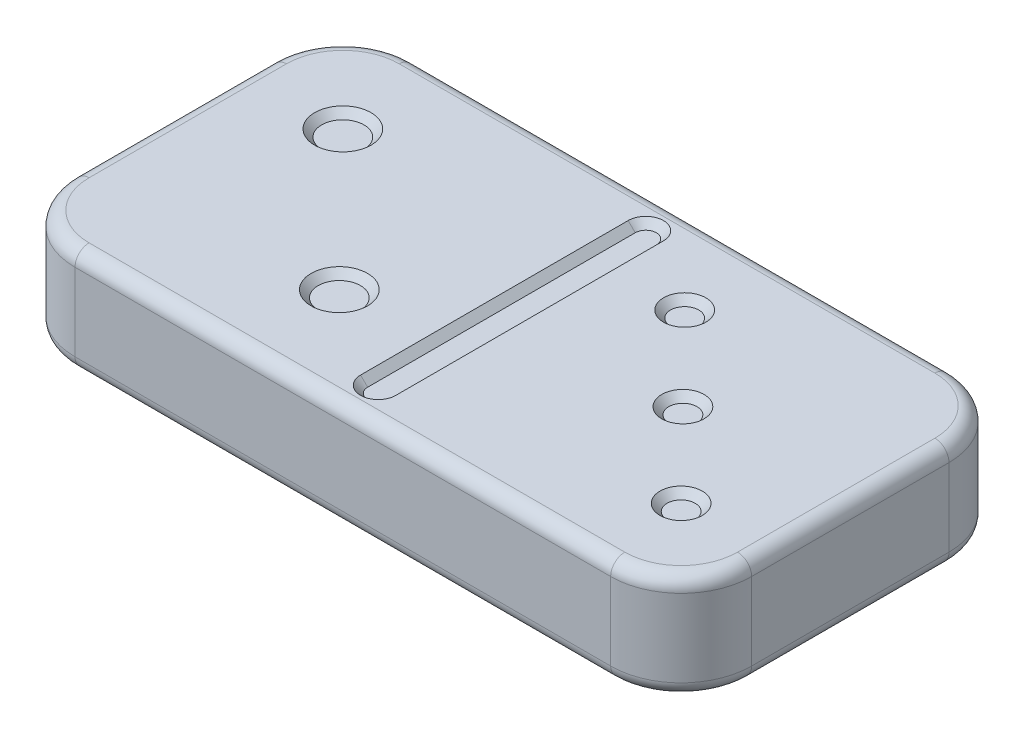
ISO-10303-21;
HEADER;
FILE_DESCRIPTION(('STEP AP214'),'2;1');
FILE_NAME('part.step','',(''),(''),'','','');
FILE_SCHEMA(('AUTOMOTIVE_DESIGN { 1 0 10303 214 1 1 1 1 }'));
ENDSEC;
DATA;
#1=APPLICATION_CONTEXT('core data for automotive mechanical design processes');
#2=APPLICATION_PROTOCOL_DEFINITION('international standard','automotive_design',2000,#1);
#3=PRODUCT_CONTEXT('',#1,'mechanical');
#4=PRODUCT('Part','Part','',(#3));
#5=PRODUCT_RELATED_PRODUCT_CATEGORY('part','',(#4));
#6=PRODUCT_DEFINITION_FORMATION('','',#4);
#7=PRODUCT_DEFINITION_CONTEXT('part definition',#1,'design');
#8=PRODUCT_DEFINITION('design','',#6,#7);
#9=PRODUCT_DEFINITION_SHAPE('','',#8);
#10=(LENGTH_UNIT() NAMED_UNIT(*) SI_UNIT(.MILLI.,.METRE.));
#11=(NAMED_UNIT(*) PLANE_ANGLE_UNIT() SI_UNIT($,.RADIAN.));
#12=(NAMED_UNIT(*) SI_UNIT($,.STERADIAN.) SOLID_ANGLE_UNIT());
#13=UNCERTAINTY_MEASURE_WITH_UNIT(LENGTH_MEASURE(1.E-05),#10,'distance_accuracy_value','');
#14=(GEOMETRIC_REPRESENTATION_CONTEXT(3) GLOBAL_UNCERTAINTY_ASSIGNED_CONTEXT((#13)) GLOBAL_UNIT_ASSIGNED_CONTEXT((#10,
#11,#12)) REPRESENTATION_CONTEXT('',''));
#15=CARTESIAN_POINT('',(0.,0.,0.));
#16=DIRECTION('',(0.,0.,1.));
#17=DIRECTION('',(1.,0.,0.));
#18=AXIS2_PLACEMENT_3D('',#15,#16,#17);
#19=CARTESIAN_POINT('',(0.,7.5,0.));
#20=DIRECTION('',(1.,0.,0.));
#21=DIRECTION('',(0.,0.,-1.));
#22=AXIS2_PLACEMENT_3D('',#19,#20,#21);
#23=PLANE('',#22);
#24=DIRECTION('',(0.,-1.,0.));
#25=VECTOR('',#24,1.);
#26=CARTESIAN_POINT('',(0.,7.5,-19.));
#27=LINE('',#26,#25);
#28=CARTESIAN_POINT('',(0.,6.5,-19.));
#29=VERTEX_POINT('',#28);
#30=CARTESIAN_POINT('',(0.,1.,-19.));
#31=VERTEX_POINT('',#30);
#32=EDGE_CURVE('E834',#29,#31,#27,.T.);
#33=ORIENTED_EDGE('',*,*,#32,.T.);
#34=DIRECTION('',(0.,0.,1.));
#35=VECTOR('',#34,1.);
#36=CARTESIAN_POINT('',(0.,1.,-5.));
#37=LINE('',#36,#35);
#38=CARTESIAN_POINT('',(0.,1.,-5.));
#39=VERTEX_POINT('',#38);
#40=EDGE_CURVE('E300',#31,#39,#37,.T.);
#41=ORIENTED_EDGE('',*,*,#40,.T.);
#42=DIRECTION('',(0.,-1.,0.));
#43=VECTOR('',#42,1.);
#44=CARTESIAN_POINT('',(0.,7.5,-5.));
#45=LINE('',#44,#43);
#46=CARTESIAN_POINT('',(0.,6.5,-5.));
#47=VERTEX_POINT('',#46);
#48=EDGE_CURVE('E195',#39,#47,#45,.F.);
#49=ORIENTED_EDGE('',*,*,#48,.T.);
#50=DIRECTION('',(0.,0.,1.));
#51=VECTOR('',#50,1.);
#52=CARTESIAN_POINT('',(0.,6.5,0.));
#53=LINE('',#52,#51);
#54=EDGE_CURVE('E224',#47,#29,#53,.F.);
#55=ORIENTED_EDGE('',*,*,#54,.T.);
#56=EDGE_LOOP('',(#33,#41,#49,#55));
#57=FACE_BOUND('',#56,.T.);
#58=ADVANCED_FACE('F37',(#57),#23,.F.);
#59=CARTESIAN_POINT('',(0.,7.5,0.));
#60=DIRECTION('',(0.,0.,-1.));
#61=DIRECTION('',(-1.,0.,0.));
#62=AXIS2_PLACEMENT_3D('',#59,#60,#61);
#63=PLANE('',#62);
#64=DIRECTION('',(0.,-1.,0.));
#65=VECTOR('',#64,1.);
#66=CARTESIAN_POINT('',(5.,7.5,0.));
#67=LINE('',#66,#65);
#68=CARTESIAN_POINT('',(5.,6.5,0.));
#69=VERTEX_POINT('',#68);
#70=CARTESIAN_POINT('',(5.,1.,0.));
#71=VERTEX_POINT('',#70);
#72=EDGE_CURVE('E820',#69,#71,#67,.T.);
#73=ORIENTED_EDGE('',*,*,#72,.T.);
#74=DIRECTION('',(1.,0.,0.));
#75=VECTOR('',#74,1.);
#76=CARTESIAN_POINT('',(43.,1.,0.));
#77=LINE('',#76,#75);
#78=CARTESIAN_POINT('',(43.,1.,0.));
#79=VERTEX_POINT('',#78);
#80=EDGE_CURVE('E294',#71,#79,#77,.T.);
#81=ORIENTED_EDGE('',*,*,#80,.T.);
#82=DIRECTION('',(0.,-1.,0.));
#83=VECTOR('',#82,1.);
#84=CARTESIAN_POINT('',(43.,7.5,0.));
#85=LINE('',#84,#83);
#86=CARTESIAN_POINT('',(43.,6.5,0.));
#87=VERTEX_POINT('',#86);
#88=EDGE_CURVE('E824',#79,#87,#85,.F.);
#89=ORIENTED_EDGE('',*,*,#88,.T.);
#90=DIRECTION('',(1.,0.,0.));
#91=VECTOR('',#90,1.);
#92=CARTESIAN_POINT('',(0.,6.5,0.));
#93=LINE('',#92,#91);
#94=EDGE_CURVE('E217',#87,#69,#93,.F.);
#95=ORIENTED_EDGE('',*,*,#94,.T.);
#96=EDGE_LOOP('',(#73,#81,#89,#95));
#97=FACE_BOUND('',#96,.T.);
#98=ADVANCED_FACE('F403',(#97),#63,.F.);
#99=CARTESIAN_POINT('',(48.,7.5,0.));
#100=DIRECTION('',(-1.,0.,0.));
#101=DIRECTION('',(0.,0.,1.));
#102=AXIS2_PLACEMENT_3D('',#99,#100,#101);
#103=PLANE('',#102);
#104=DIRECTION('',(0.,-1.,0.));
#105=VECTOR('',#104,1.);
#106=CARTESIAN_POINT('',(48.,7.5,-5.));
#107=LINE('',#106,#105);
#108=CARTESIAN_POINT('',(48.,6.5,-5.));
#109=VERTEX_POINT('',#108);
#110=CARTESIAN_POINT('',(48.,1.,-5.));
#111=VERTEX_POINT('',#110);
#112=EDGE_CURVE('E817',#109,#111,#107,.T.);
#113=ORIENTED_EDGE('',*,*,#112,.T.);
#114=DIRECTION('',(0.,0.,-1.));
#115=VECTOR('',#114,1.);
#116=CARTESIAN_POINT('',(48.,1.,-19.));
#117=LINE('',#116,#115);
#118=CARTESIAN_POINT('',(48.,1.,-19.));
#119=VERTEX_POINT('',#118);
#120=EDGE_CURVE('E288',#111,#119,#117,.T.);
#121=ORIENTED_EDGE('',*,*,#120,.T.);
#122=DIRECTION('',(0.,-1.,0.));
#123=VECTOR('',#122,1.);
#124=CARTESIAN_POINT('',(48.,7.5,-19.));
#125=LINE('',#124,#123);
#126=CARTESIAN_POINT('',(48.,6.5,-19.));
#127=VERTEX_POINT('',#126);
#128=EDGE_CURVE('E259',#119,#127,#125,.F.);
#129=ORIENTED_EDGE('',*,*,#128,.T.);
#130=DIRECTION('',(0.,0.,-1.));
#131=VECTOR('',#130,1.);
#132=CARTESIAN_POINT('',(48.,6.5,0.));
#133=LINE('',#132,#131);
#134=EDGE_CURVE('E205',#127,#109,#133,.F.);
#135=ORIENTED_EDGE('',*,*,#134,.T.);
#136=EDGE_LOOP('',(#113,#121,#129,#135));
#137=FACE_BOUND('',#136,.T.);
#138=ADVANCED_FACE('F409',(#137),#103,.F.);
#139=CARTESIAN_POINT('',(0.,7.5,-24.));
#140=DIRECTION('',(0.,0.,1.));
#141=DIRECTION('',(1.,0.,0.));
#142=AXIS2_PLACEMENT_3D('',#139,#140,#141);
#143=PLANE('',#142);
#144=DIRECTION('',(0.,-1.,0.));
#145=VECTOR('',#144,1.);
#146=CARTESIAN_POINT('',(43.,7.5,-24.));
#147=LINE('',#146,#145);
#148=CARTESIAN_POINT('',(43.,6.5,-24.));
#149=VERTEX_POINT('',#148);
#150=CARTESIAN_POINT('',(43.,1.,-24.));
#151=VERTEX_POINT('',#150);
#152=EDGE_CURVE('E830',#149,#151,#147,.T.);
#153=ORIENTED_EDGE('',*,*,#152,.T.);
#154=DIRECTION('',(-1.,0.,0.));
#155=VECTOR('',#154,1.);
#156=CARTESIAN_POINT('',(4.99999999999999,1.,-24.));
#157=LINE('',#156,#155);
#158=CARTESIAN_POINT('',(4.99999999999999,1.,-24.));
#159=VERTEX_POINT('',#158);
#160=EDGE_CURVE('E306',#151,#159,#157,.T.);
#161=ORIENTED_EDGE('',*,*,#160,.T.);
#162=DIRECTION('',(0.,-1.,0.));
#163=VECTOR('',#162,1.);
#164=CARTESIAN_POINT('',(4.99999999999999,7.5,-24.));
#165=LINE('',#164,#163);
#166=CARTESIAN_POINT('',(4.99999999999999,6.5,-24.));
#167=VERTEX_POINT('',#166);
#168=EDGE_CURVE('E827',#159,#167,#165,.F.);
#169=ORIENTED_EDGE('',*,*,#168,.T.);
#170=DIRECTION('',(-1.,0.,0.));
#171=VECTOR('',#170,1.);
#172=CARTESIAN_POINT('',(0.,6.5,-24.));
#173=LINE('',#172,#171);
#174=EDGE_CURVE('E231',#167,#149,#173,.F.);
#175=ORIENTED_EDGE('',*,*,#174,.T.);
#176=EDGE_LOOP('',(#153,#161,#169,#175));
#177=FACE_BOUND('',#176,.T.);
#178=ADVANCED_FACE('F708',(#177),#143,.F.);
#179=CARTESIAN_POINT('',(0.,7.5,-24.));
#180=DIRECTION('',(0.,-1.,0.));
#181=DIRECTION('',(0.,0.,-1.));
#182=AXIS2_PLACEMENT_3D('',#179,#180,#181);
#183=PLANE('',#182);
#184=CARTESIAN_POINT('',(16.75,7.5,-7.));
#185=DIRECTION('',(0.,1.,0.));
#186=DIRECTION('',(0.,0.,1.));
#187=AXIS2_PLACEMENT_3D('',#184,#185,#186);
#188=CIRCLE('',#187,2.);
#189=CARTESIAN_POINT('',(16.75,7.5,-5.));
#190=VERTEX_POINT('',#189);
#191=EDGE_CURVE('E787',#190,#190,#188,.T.);
#192=ORIENTED_EDGE('',*,*,#191,.F.);
#193=EDGE_LOOP('',(#192));
#194=FACE_BOUND('',#193,.T.);
#195=CARTESIAN_POINT('',(6.99999999999999,7.5,-17.));
#196=DIRECTION('',(0.,1.,0.));
#197=DIRECTION('',(0.,0.,1.));
#198=AXIS2_PLACEMENT_3D('',#195,#196,#197);
#199=CIRCLE('',#198,2.);
#200=CARTESIAN_POINT('',(6.99999999999999,7.5,-15.));
#201=VERTEX_POINT('',#200);
#202=EDGE_CURVE('E791',#201,#201,#199,.T.);
#203=ORIENTED_EDGE('',*,*,#202,.F.);
#204=EDGE_LOOP('',(#203));
#205=FACE_BOUND('',#204,.T.);
#206=CARTESIAN_POINT('',(42.,7.5,-6.));
#207=DIRECTION('',(0.,1.,0.));
#208=DIRECTION('',(0.,0.,1.));
#209=AXIS2_PLACEMENT_3D('',#206,#207,#208);
#210=CIRCLE('',#209,1.5);
#211=CARTESIAN_POINT('',(42.,7.5,-4.5));
#212=VERTEX_POINT('',#211);
#213=EDGE_CURVE('E795',#212,#212,#210,.T.);
#214=ORIENTED_EDGE('',*,*,#213,.F.);
#215=EDGE_LOOP('',(#214));
#216=FACE_BOUND('',#215,.T.);
#217=CARTESIAN_POINT('',(36.125,7.5,-12.));
#218=DIRECTION('',(0.,1.,0.));
#219=DIRECTION('',(0.,0.,1.));
#220=AXIS2_PLACEMENT_3D('',#217,#218,#219);
#221=CIRCLE('',#220,1.5);
#222=CARTESIAN_POINT('',(36.125,7.5,-10.5));
#223=VERTEX_POINT('',#222);
#224=EDGE_CURVE('E799',#223,#223,#221,.T.);
#225=ORIENTED_EDGE('',*,*,#224,.F.);
#226=EDGE_LOOP('',(#225));
#227=FACE_BOUND('',#226,.T.);
#228=CARTESIAN_POINT('',(30.25,7.5,-18.));
#229=DIRECTION('',(0.,1.,0.));
#230=DIRECTION('',(0.,0.,1.));
#231=AXIS2_PLACEMENT_3D('',#228,#229,#230);
#232=CIRCLE('',#231,1.5);
#233=CARTESIAN_POINT('',(30.25,7.5,-16.5));
#234=VERTEX_POINT('',#233);
#235=EDGE_CURVE('E802',#234,#234,#232,.T.);
#236=ORIENTED_EDGE('',*,*,#235,.F.);
#237=EDGE_LOOP('',(#236));
#238=FACE_BOUND('',#237,.T.);
#239=DIRECTION('',(0.,0.,-1.));
#240=VECTOR('',#239,1.);
#241=CARTESIAN_POINT('',(22.75,7.5,-24.));
#242=LINE('',#241,#240);
#243=CARTESIAN_POINT('',(22.75,7.5,-2.5085750787772));
#244=VERTEX_POINT('',#243);
#245=CARTESIAN_POINT('',(22.75,7.5,-21.4914249212228));
#246=VERTEX_POINT('',#245);
#247=EDGE_CURVE('E309',#244,#246,#242,.T.);
#248=ORIENTED_EDGE('',*,*,#247,.T.);
#249=CARTESIAN_POINT('',(24.,7.5,-21.4914249212228));
#250=DIRECTION('',(0.,-1.,0.));
#251=DIRECTION('',(0.,0.,-1.));
#252=AXIS2_PLACEMENT_3D('',#249,#250,#251);
#253=CIRCLE('',#252,1.25000000000001);
#254=CARTESIAN_POINT('',(25.25,7.5,-21.4914249212228));
#255=VERTEX_POINT('',#254);
#256=EDGE_CURVE('E347',#246,#255,#253,.T.);
#257=ORIENTED_EDGE('',*,*,#256,.T.);
#258=DIRECTION('',(0.,0.,1.));
#259=VECTOR('',#258,1.);
#260=CARTESIAN_POINT('',(25.25,7.5,-24.));
#261=LINE('',#260,#259);
#262=CARTESIAN_POINT('',(25.25,7.5,-2.5085750787772));
#263=VERTEX_POINT('',#262);
#264=EDGE_CURVE('E344',#255,#263,#261,.T.);
#265=ORIENTED_EDGE('',*,*,#264,.T.);
#266=CARTESIAN_POINT('',(24.,7.5,-2.5085750787772));
#267=DIRECTION('',(0.,-1.,0.));
#268=DIRECTION('',(0.,0.,-1.));
#269=AXIS2_PLACEMENT_3D('',#266,#267,#268);
#270=CIRCLE('',#269,1.25000000000001);
#271=EDGE_CURVE('E341',#263,#244,#270,.T.);
#272=ORIENTED_EDGE('',*,*,#271,.T.);
#273=EDGE_LOOP('',(#248,#257,#265,#272));
#274=FACE_BOUND('',#273,.T.);
#275=DIRECTION('',(0.,0.,-1.));
#276=VECTOR('',#275,1.);
#277=CARTESIAN_POINT('',(47.,7.5,-24.));
#278=LINE('',#277,#276);
#279=CARTESIAN_POINT('',(47.,7.5,-5.));
#280=VERTEX_POINT('',#279);
#281=CARTESIAN_POINT('',(47.,7.5,-19.));
#282=VERTEX_POINT('',#281);
#283=EDGE_CURVE('E199',#280,#282,#278,.T.);
#284=ORIENTED_EDGE('',*,*,#283,.T.);
#285=CARTESIAN_POINT('',(43.,7.5,-19.));
#286=DIRECTION('',(0.,-1.,0.));
#287=DIRECTION('',(0.,0.,-1.));
#288=AXIS2_PLACEMENT_3D('',#285,#286,#287);
#289=CIRCLE('',#288,4.);
#290=CARTESIAN_POINT('',(43.,7.5,-23.));
#291=VERTEX_POINT('',#290);
#292=EDGE_CURVE('E177',#282,#291,#289,.F.);
#293=ORIENTED_EDGE('',*,*,#292,.T.);
#294=DIRECTION('',(-1.,0.,0.));
#295=VECTOR('',#294,1.);
#296=CARTESIAN_POINT('',(0.,7.5,-23.));
#297=LINE('',#296,#295);
#298=CARTESIAN_POINT('',(4.99999999999999,7.5,-23.));
#299=VERTEX_POINT('',#298);
#300=EDGE_CURVE('E187',#291,#299,#297,.T.);
#301=ORIENTED_EDGE('',*,*,#300,.T.);
#302=CARTESIAN_POINT('',(4.99999999999999,7.5,-19.));
#303=DIRECTION('',(0.,-1.,0.));
#304=DIRECTION('',(0.,0.,-1.));
#305=AXIS2_PLACEMENT_3D('',#302,#303,#304);
#306=CIRCLE('',#305,4.);
#307=CARTESIAN_POINT('',(0.999999999999989,7.5,-19.));
#308=VERTEX_POINT('',#307);
#309=EDGE_CURVE('E194',#299,#308,#306,.F.);
#310=ORIENTED_EDGE('',*,*,#309,.T.);
#311=DIRECTION('',(0.,0.,1.));
#312=VECTOR('',#311,1.);
#313=CARTESIAN_POINT('',(0.999999999999986,7.5,-24.));
#314=LINE('',#313,#312);
#315=CARTESIAN_POINT('',(0.999999999999997,7.5,-5.));
#316=VERTEX_POINT('',#315);
#317=EDGE_CURVE('E841',#308,#316,#314,.T.);
#318=ORIENTED_EDGE('',*,*,#317,.T.);
#319=CARTESIAN_POINT('',(5.,7.5,-5.));
#320=DIRECTION('',(0.,-1.,0.));
#321=DIRECTION('',(0.,0.,-1.));
#322=AXIS2_PLACEMENT_3D('',#319,#320,#321);
#323=CIRCLE('',#322,4.);
#324=CARTESIAN_POINT('',(5.,7.5,-1.));
#325=VERTEX_POINT('',#324);
#326=EDGE_CURVE('E844',#316,#325,#323,.F.);
#327=ORIENTED_EDGE('',*,*,#326,.T.);
#328=DIRECTION('',(1.,0.,0.));
#329=VECTOR('',#328,1.);
#330=CARTESIAN_POINT('',(0.,7.5,-1.));
#331=LINE('',#330,#329);
#332=CARTESIAN_POINT('',(43.,7.5,-1.));
#333=VERTEX_POINT('',#332);
#334=EDGE_CURVE('E847',#325,#333,#331,.T.);
#335=ORIENTED_EDGE('',*,*,#334,.T.);
#336=CARTESIAN_POINT('',(43.,7.5,-5.));
#337=DIRECTION('',(0.,-1.,0.));
#338=DIRECTION('',(0.,0.,-1.));
#339=AXIS2_PLACEMENT_3D('',#336,#337,#338);
#340=CIRCLE('',#339,4.);
#341=EDGE_CURVE('E207',#333,#280,#340,.F.);
#342=ORIENTED_EDGE('',*,*,#341,.T.);
#343=EDGE_LOOP('',(#284,#293,#301,#310,#318,#327,#335,#342));
#344=FACE_BOUND('',#343,.T.);
#345=ADVANCED_FACE('F197',(#194,#205,#216,#227,#238,#274,#344),#183,.F.);
#346=CARTESIAN_POINT('',(0.,0.,-24.));
#347=DIRECTION('',(0.,-1.,0.));
#348=DIRECTION('',(0.,0.,-1.));
#349=AXIS2_PLACEMENT_3D('',#346,#347,#348);
#350=PLANE('',#349);
#351=DIRECTION('',(-1.,0.,0.));
#352=VECTOR('',#351,1.);
#353=CARTESIAN_POINT('',(43.,0.,-23.));
#354=LINE('',#353,#352);
#355=CARTESIAN_POINT('',(4.99999999999999,0.,-23.));
#356=VERTEX_POINT('',#355);
#357=CARTESIAN_POINT('',(43.,0.,-23.));
#358=VERTEX_POINT('',#357);
#359=EDGE_CURVE('E233',#356,#358,#354,.F.);
#360=ORIENTED_EDGE('',*,*,#359,.T.);
#361=CARTESIAN_POINT('',(43.,0.,-19.));
#362=DIRECTION('',(0.,-1.,0.));
#363=DIRECTION('',(0.,0.,-1.));
#364=AXIS2_PLACEMENT_3D('',#361,#362,#363);
#365=CIRCLE('',#364,4.);
#366=CARTESIAN_POINT('',(47.,0.,-19.));
#367=VERTEX_POINT('',#366);
#368=EDGE_CURVE('E280',#358,#367,#365,.T.);
#369=ORIENTED_EDGE('',*,*,#368,.T.);
#370=DIRECTION('',(0.,0.,-1.));
#371=VECTOR('',#370,1.);
#372=CARTESIAN_POINT('',(47.,0.,-5.));
#373=LINE('',#372,#371);
#374=CARTESIAN_POINT('',(47.,0.,-5.));
#375=VERTEX_POINT('',#374);
#376=EDGE_CURVE('E277',#367,#375,#373,.F.);
#377=ORIENTED_EDGE('',*,*,#376,.T.);
#378=CARTESIAN_POINT('',(43.,0.,-5.));
#379=DIRECTION('',(0.,-1.,0.));
#380=DIRECTION('',(0.,0.,-1.));
#381=AXIS2_PLACEMENT_3D('',#378,#379,#380);
#382=CIRCLE('',#381,4.);
#383=CARTESIAN_POINT('',(43.,0.,-1.));
#384=VERTEX_POINT('',#383);
#385=EDGE_CURVE('E274',#375,#384,#382,.T.);
#386=ORIENTED_EDGE('',*,*,#385,.T.);
#387=DIRECTION('',(1.,0.,0.));
#388=VECTOR('',#387,1.);
#389=CARTESIAN_POINT('',(5.,0.,-1.));
#390=LINE('',#389,#388);
#391=CARTESIAN_POINT('',(5.,0.,-1.));
#392=VERTEX_POINT('',#391);
#393=EDGE_CURVE('E271',#384,#392,#390,.F.);
#394=ORIENTED_EDGE('',*,*,#393,.T.);
#395=CARTESIAN_POINT('',(5.,0.,-5.));
#396=DIRECTION('',(0.,-1.,0.));
#397=DIRECTION('',(0.,0.,-1.));
#398=AXIS2_PLACEMENT_3D('',#395,#396,#397);
#399=CIRCLE('',#398,4.);
#400=CARTESIAN_POINT('',(0.999999999999997,0.,-5.));
#401=VERTEX_POINT('',#400);
#402=EDGE_CURVE('E268',#392,#401,#399,.T.);
#403=ORIENTED_EDGE('',*,*,#402,.T.);
#404=DIRECTION('',(0.,0.,1.));
#405=VECTOR('',#404,1.);
#406=CARTESIAN_POINT('',(0.999999999999989,0.,-19.));
#407=LINE('',#406,#405);
#408=CARTESIAN_POINT('',(0.999999999999989,0.,-19.));
#409=VERTEX_POINT('',#408);
#410=EDGE_CURVE('E265',#401,#409,#407,.F.);
#411=ORIENTED_EDGE('',*,*,#410,.T.);
#412=CARTESIAN_POINT('',(4.99999999999999,0.,-19.));
#413=DIRECTION('',(0.,-1.,0.));
#414=DIRECTION('',(0.,0.,-1.));
#415=AXIS2_PLACEMENT_3D('',#412,#413,#414);
#416=CIRCLE('',#415,4.);
#417=EDGE_CURVE('E262',#409,#356,#416,.T.);
#418=ORIENTED_EDGE('',*,*,#417,.T.);
#419=EDGE_LOOP('',(#360,#369,#377,#386,#394,#403,#411,#418));
#420=FACE_BOUND('',#419,.T.);
#421=ADVANCED_FACE('F419',(#420),#350,.T.);
#422=CARTESIAN_POINT('',(43.,7.5,-5.));
#423=DIRECTION('',(0.,-1.,0.));
#424=DIRECTION('',(0.,0.,-1.));
#425=AXIS2_PLACEMENT_3D('',#422,#423,#424);
#426=CYLINDRICAL_SURFACE('',#425,5.);
#427=ORIENTED_EDGE('',*,*,#88,.F.);
#428=CARTESIAN_POINT('',(43.,1.,-5.));
#429=DIRECTION('',(0.,-1.,0.));
#430=DIRECTION('',(0.,0.,-1.));
#431=AXIS2_PLACEMENT_3D('',#428,#429,#430);
#432=CIRCLE('',#431,5.);
#433=EDGE_CURVE('E291',#79,#111,#432,.F.);
#434=ORIENTED_EDGE('',*,*,#433,.T.);
#435=ORIENTED_EDGE('',*,*,#112,.F.);
#436=CARTESIAN_POINT('',(43.,6.5,-5.));
#437=DIRECTION('',(0.,-1.,0.));
#438=DIRECTION('',(0.,0.,-1.));
#439=AXIS2_PLACEMENT_3D('',#436,#437,#438);
#440=CIRCLE('',#439,5.);
#441=EDGE_CURVE('E213',#109,#87,#440,.T.);
#442=ORIENTED_EDGE('',*,*,#441,.T.);
#443=EDGE_LOOP('',(#427,#434,#435,#442));
#444=FACE_BOUND('',#443,.T.);
#445=ADVANCED_FACE('F415',(#444),#426,.T.);
#446=CARTESIAN_POINT('',(43.,7.5,-19.));
#447=DIRECTION('',(0.,-1.,0.));
#448=DIRECTION('',(0.,0.,-1.));
#449=AXIS2_PLACEMENT_3D('',#446,#447,#448);
#450=CYLINDRICAL_SURFACE('',#449,5.);
#451=ORIENTED_EDGE('',*,*,#128,.F.);
#452=CARTESIAN_POINT('',(43.,1.,-19.));
#453=DIRECTION('',(0.,-1.,0.));
#454=DIRECTION('',(0.,0.,-1.));
#455=AXIS2_PLACEMENT_3D('',#452,#453,#454);
#456=CIRCLE('',#455,5.);
#457=EDGE_CURVE('E284',#119,#151,#456,.F.);
#458=ORIENTED_EDGE('',*,*,#457,.T.);
#459=ORIENTED_EDGE('',*,*,#152,.F.);
#460=CARTESIAN_POINT('',(43.,6.5,-19.));
#461=DIRECTION('',(0.,-1.,0.));
#462=DIRECTION('',(0.,0.,-1.));
#463=AXIS2_PLACEMENT_3D('',#460,#461,#462);
#464=CIRCLE('',#463,5.);
#465=EDGE_CURVE('E179',#149,#127,#464,.T.);
#466=ORIENTED_EDGE('',*,*,#465,.T.);
#467=EDGE_LOOP('',(#451,#458,#459,#466));
#468=FACE_BOUND('',#467,.T.);
#469=ADVANCED_FACE('F418',(#468),#450,.T.);
#470=CARTESIAN_POINT('',(5.,7.5,-5.));
#471=DIRECTION('',(0.,-1.,0.));
#472=DIRECTION('',(0.,0.,-1.));
#473=AXIS2_PLACEMENT_3D('',#470,#471,#472);
#474=CYLINDRICAL_SURFACE('',#473,5.);
#475=ORIENTED_EDGE('',*,*,#48,.F.);
#476=CARTESIAN_POINT('',(5.,1.,-5.));
#477=DIRECTION('',(0.,-1.,0.));
#478=DIRECTION('',(0.,0.,-1.));
#479=AXIS2_PLACEMENT_3D('',#476,#477,#478);
#480=CIRCLE('',#479,5.);
#481=EDGE_CURVE('E297',#39,#71,#480,.F.);
#482=ORIENTED_EDGE('',*,*,#481,.T.);
#483=ORIENTED_EDGE('',*,*,#72,.F.);
#484=CARTESIAN_POINT('',(5.,6.5,-5.));
#485=DIRECTION('',(0.,-1.,0.));
#486=DIRECTION('',(0.,0.,-1.));
#487=AXIS2_PLACEMENT_3D('',#484,#485,#486);
#488=CIRCLE('',#487,5.);
#489=EDGE_CURVE('E220',#69,#47,#488,.T.);
#490=ORIENTED_EDGE('',*,*,#489,.T.);
#491=EDGE_LOOP('',(#475,#482,#483,#490));
#492=FACE_BOUND('',#491,.T.);
#493=ADVANCED_FACE('F423',(#492),#474,.T.);
#494=CARTESIAN_POINT('',(4.99999999999999,7.5,-19.));
#495=DIRECTION('',(0.,-1.,0.));
#496=DIRECTION('',(0.,0.,-1.));
#497=AXIS2_PLACEMENT_3D('',#494,#495,#496);
#498=CYLINDRICAL_SURFACE('',#497,5.);
#499=ORIENTED_EDGE('',*,*,#168,.F.);
#500=CARTESIAN_POINT('',(4.99999999999999,1.,-19.));
#501=DIRECTION('',(0.,-1.,0.));
#502=DIRECTION('',(0.,0.,-1.));
#503=AXIS2_PLACEMENT_3D('',#500,#501,#502);
#504=CIRCLE('',#503,5.);
#505=EDGE_CURVE('E303',#159,#31,#504,.F.);
#506=ORIENTED_EDGE('',*,*,#505,.T.);
#507=ORIENTED_EDGE('',*,*,#32,.F.);
#508=CARTESIAN_POINT('',(4.99999999999999,6.5,-19.));
#509=DIRECTION('',(0.,-1.,0.));
#510=DIRECTION('',(0.,0.,-1.));
#511=AXIS2_PLACEMENT_3D('',#508,#509,#510);
#512=CIRCLE('',#511,5.);
#513=EDGE_CURVE('E227',#29,#167,#512,.T.);
#514=ORIENTED_EDGE('',*,*,#513,.T.);
#515=EDGE_LOOP('',(#499,#506,#507,#514));
#516=FACE_BOUND('',#515,.T.);
#517=ADVANCED_FACE('F427',(#516),#498,.T.);
#518=CARTESIAN_POINT('',(5.,6.5,-5.));
#519=DIRECTION('',(0.,-1.,0.));
#520=DIRECTION('',(0.,0.,-1.));
#521=AXIS2_PLACEMENT_3D('',#518,#519,#520);
#522=TOROIDAL_SURFACE('',#521,4.,1.);
#523=CARTESIAN_POINT('',(0.999999999999997,6.5,-5.));
#524=DIRECTION('',(0.,0.,-1.));
#525=DIRECTION('',(-1.,0.,0.));
#526=AXIS2_PLACEMENT_3D('',#523,#524,#525);
#527=CIRCLE('',#526,1.);
#528=EDGE_CURVE('E251',#47,#316,#527,.T.);
#529=ORIENTED_EDGE('',*,*,#528,.F.);
#530=ORIENTED_EDGE('',*,*,#489,.F.);
#531=CARTESIAN_POINT('',(5.,6.5,-1.));
#532=DIRECTION('',(1.,0.,0.));
#533=DIRECTION('',(0.,0.,-1.));
#534=AXIS2_PLACEMENT_3D('',#531,#532,#533);
#535=CIRCLE('',#534,1.);
#536=EDGE_CURVE('E255',#325,#69,#535,.T.);
#537=ORIENTED_EDGE('',*,*,#536,.F.);
#538=ORIENTED_EDGE('',*,*,#326,.F.);
#539=EDGE_LOOP('',(#529,#530,#537,#538));
#540=FACE_BOUND('',#539,.T.);
#541=ADVANCED_FACE('F431',(#540),#522,.T.);
#542=CARTESIAN_POINT('',(0.,6.5,-1.));
#543=DIRECTION('',(1.,0.,0.));
#544=DIRECTION('',(0.,0.,-1.));
#545=AXIS2_PLACEMENT_3D('',#542,#543,#544);
#546=CYLINDRICAL_SURFACE('',#545,1.);
#547=ORIENTED_EDGE('',*,*,#536,.T.);
#548=ORIENTED_EDGE('',*,*,#94,.F.);
#549=CARTESIAN_POINT('',(43.,6.5,-1.));
#550=DIRECTION('',(1.,0.,0.));
#551=DIRECTION('',(0.,0.,-1.));
#552=AXIS2_PLACEMENT_3D('',#549,#550,#551);
#553=CIRCLE('',#552,1.);
#554=EDGE_CURVE('E247',#333,#87,#553,.T.);
#555=ORIENTED_EDGE('',*,*,#554,.F.);
#556=ORIENTED_EDGE('',*,*,#334,.F.);
#557=EDGE_LOOP('',(#547,#548,#555,#556));
#558=FACE_BOUND('',#557,.T.);
#559=ADVANCED_FACE('F453',(#558),#546,.T.);
#560=CARTESIAN_POINT('',(0.999999999999986,6.5,-24.));
#561=DIRECTION('',(0.,0.,1.));
#562=DIRECTION('',(1.,0.,0.));
#563=AXIS2_PLACEMENT_3D('',#560,#561,#562);
#564=CYLINDRICAL_SURFACE('',#563,1.);
#565=ORIENTED_EDGE('',*,*,#528,.T.);
#566=ORIENTED_EDGE('',*,*,#317,.F.);
#567=CARTESIAN_POINT('',(0.999999999999989,6.5,-19.));
#568=DIRECTION('',(0.,0.,-1.));
#569=DIRECTION('',(-1.,0.,0.));
#570=AXIS2_PLACEMENT_3D('',#567,#568,#569);
#571=CIRCLE('',#570,1.);
#572=EDGE_CURVE('E243',#29,#308,#571,.T.);
#573=ORIENTED_EDGE('',*,*,#572,.F.);
#574=ORIENTED_EDGE('',*,*,#54,.F.);
#575=EDGE_LOOP('',(#565,#566,#573,#574));
#576=FACE_BOUND('',#575,.T.);
#577=ADVANCED_FACE('F449',(#576),#564,.T.);
#578=CARTESIAN_POINT('',(43.,6.5,-5.));
#579=DIRECTION('',(0.,-1.,0.));
#580=DIRECTION('',(0.,0.,-1.));
#581=AXIS2_PLACEMENT_3D('',#578,#579,#580);
#582=TOROIDAL_SURFACE('',#581,4.,1.);
#583=ORIENTED_EDGE('',*,*,#554,.T.);
#584=ORIENTED_EDGE('',*,*,#441,.F.);
#585=CARTESIAN_POINT('',(47.,6.5,-5.));
#586=DIRECTION('',(0.,0.,-1.));
#587=DIRECTION('',(-1.,0.,0.));
#588=AXIS2_PLACEMENT_3D('',#585,#586,#587);
#589=CIRCLE('',#588,1.);
#590=EDGE_CURVE('E239',#280,#109,#589,.T.);
#591=ORIENTED_EDGE('',*,*,#590,.F.);
#592=ORIENTED_EDGE('',*,*,#341,.F.);
#593=EDGE_LOOP('',(#583,#584,#591,#592));
#594=FACE_BOUND('',#593,.T.);
#595=ADVANCED_FACE('F445',(#594),#582,.T.);
#596=CARTESIAN_POINT('',(4.99999999999999,6.5,-19.));
#597=DIRECTION('',(0.,-1.,0.));
#598=DIRECTION('',(0.,0.,-1.));
#599=AXIS2_PLACEMENT_3D('',#596,#597,#598);
#600=TOROIDAL_SURFACE('',#599,4.,1.);
#601=ORIENTED_EDGE('',*,*,#572,.T.);
#602=ORIENTED_EDGE('',*,*,#309,.F.);
#603=CARTESIAN_POINT('',(4.99999999999999,6.5,-23.));
#604=DIRECTION('',(1.,0.,0.));
#605=DIRECTION('',(0.,0.,-1.));
#606=AXIS2_PLACEMENT_3D('',#603,#604,#605);
#607=CIRCLE('',#606,1.);
#608=EDGE_CURVE('E190',#167,#299,#607,.T.);
#609=ORIENTED_EDGE('',*,*,#608,.F.);
#610=ORIENTED_EDGE('',*,*,#513,.F.);
#611=EDGE_LOOP('',(#601,#602,#609,#610));
#612=FACE_BOUND('',#611,.T.);
#613=ADVANCED_FACE('F441',(#612),#600,.T.);
#614=CARTESIAN_POINT('',(47.,6.5,-24.));
#615=DIRECTION('',(0.,0.,-1.));
#616=DIRECTION('',(-1.,0.,0.));
#617=AXIS2_PLACEMENT_3D('',#614,#615,#616);
#618=CYLINDRICAL_SURFACE('',#617,1.);
#619=ORIENTED_EDGE('',*,*,#590,.T.);
#620=ORIENTED_EDGE('',*,*,#134,.F.);
#621=CARTESIAN_POINT('',(47.,6.5,-19.));
#622=DIRECTION('',(0.,0.,-1.));
#623=DIRECTION('',(-1.,0.,0.));
#624=AXIS2_PLACEMENT_3D('',#621,#622,#623);
#625=CIRCLE('',#624,1.);
#626=EDGE_CURVE('E183',#282,#127,#625,.T.);
#627=ORIENTED_EDGE('',*,*,#626,.F.);
#628=ORIENTED_EDGE('',*,*,#283,.F.);
#629=EDGE_LOOP('',(#619,#620,#627,#628));
#630=FACE_BOUND('',#629,.T.);
#631=ADVANCED_FACE('F438',(#630),#618,.T.);
#632=CARTESIAN_POINT('',(0.,6.5,-23.));
#633=DIRECTION('',(-1.,0.,0.));
#634=DIRECTION('',(0.,0.,1.));
#635=AXIS2_PLACEMENT_3D('',#632,#633,#634);
#636=CYLINDRICAL_SURFACE('',#635,1.);
#637=ORIENTED_EDGE('',*,*,#608,.T.);
#638=ORIENTED_EDGE('',*,*,#300,.F.);
#639=CARTESIAN_POINT('',(43.,6.5,-23.));
#640=DIRECTION('',(1.,0.,0.));
#641=DIRECTION('',(0.,0.,-1.));
#642=AXIS2_PLACEMENT_3D('',#639,#640,#641);
#643=CIRCLE('',#642,1.);
#644=EDGE_CURVE('E172',#149,#291,#643,.T.);
#645=ORIENTED_EDGE('',*,*,#644,.F.);
#646=ORIENTED_EDGE('',*,*,#174,.F.);
#647=EDGE_LOOP('',(#637,#638,#645,#646));
#648=FACE_BOUND('',#647,.T.);
#649=ADVANCED_FACE('F188',(#648),#636,.T.);
#650=CARTESIAN_POINT('',(43.,6.5,-19.));
#651=DIRECTION('',(0.,-1.,0.));
#652=DIRECTION('',(0.,0.,-1.));
#653=AXIS2_PLACEMENT_3D('',#650,#651,#652);
#654=TOROIDAL_SURFACE('',#653,4.,1.);
#655=ORIENTED_EDGE('',*,*,#626,.T.);
#656=ORIENTED_EDGE('',*,*,#465,.F.);
#657=ORIENTED_EDGE('',*,*,#644,.T.);
#658=ORIENTED_EDGE('',*,*,#292,.F.);
#659=EDGE_LOOP('',(#655,#656,#657,#658));
#660=FACE_BOUND('',#659,.T.);
#661=ADVANCED_FACE('F175',(#660),#654,.T.);
#662=CARTESIAN_POINT('',(5.,1.,-5.));
#663=DIRECTION('',(0.,-1.,0.));
#664=DIRECTION('',(0.,0.,-1.));
#665=AXIS2_PLACEMENT_3D('',#662,#663,#664);
#666=TOROIDAL_SURFACE('',#665,4.,1.);
#667=CARTESIAN_POINT('',(5.,1.,-1.));
#668=DIRECTION('',(1.,0.,0.));
#669=DIRECTION('',(0.,0.,-1.));
#670=AXIS2_PLACEMENT_3D('',#667,#668,#669);
#671=CIRCLE('',#670,1.);
#672=EDGE_CURVE('E332',#71,#392,#671,.T.);
#673=ORIENTED_EDGE('',*,*,#672,.F.);
#674=ORIENTED_EDGE('',*,*,#481,.F.);
#675=CARTESIAN_POINT('',(0.999999999999997,1.,-5.));
#676=DIRECTION('',(0.,0.,-1.));
#677=DIRECTION('',(-1.,0.,0.));
#678=AXIS2_PLACEMENT_3D('',#675,#676,#677);
#679=CIRCLE('',#678,1.);
#680=EDGE_CURVE('E184',#401,#39,#679,.T.);
#681=ORIENTED_EDGE('',*,*,#680,.F.);
#682=ORIENTED_EDGE('',*,*,#402,.F.);
#683=EDGE_LOOP('',(#673,#674,#681,#682));
#684=FACE_BOUND('',#683,.T.);
#685=ADVANCED_FACE('F435',(#684),#666,.T.);
#686=CARTESIAN_POINT('',(1.,1.,0.));
#687=DIRECTION('',(0.,0.,-1.));
#688=DIRECTION('',(-1.,0.,0.));
#689=AXIS2_PLACEMENT_3D('',#686,#687,#688);
#690=CYLINDRICAL_SURFACE('',#689,1.);
#691=ORIENTED_EDGE('',*,*,#680,.T.);
#692=ORIENTED_EDGE('',*,*,#40,.F.);
#693=CARTESIAN_POINT('',(0.999999999999989,1.,-19.));
#694=DIRECTION('',(0.,0.,-1.));
#695=DIRECTION('',(-1.,0.,0.));
#696=AXIS2_PLACEMENT_3D('',#693,#694,#695);
#697=CIRCLE('',#696,1.);
#698=EDGE_CURVE('E328',#409,#31,#697,.T.);
#699=ORIENTED_EDGE('',*,*,#698,.F.);
#700=ORIENTED_EDGE('',*,*,#410,.F.);
#701=EDGE_LOOP('',(#691,#692,#699,#700));
#702=FACE_BOUND('',#701,.T.);
#703=ADVANCED_FACE('F479',(#702),#690,.T.);
#704=CARTESIAN_POINT('',(0.,1.,-1.));
#705=DIRECTION('',(-1.,0.,0.));
#706=DIRECTION('',(0.,0.,1.));
#707=AXIS2_PLACEMENT_3D('',#704,#705,#706);
#708=CYLINDRICAL_SURFACE('',#707,1.);
#709=ORIENTED_EDGE('',*,*,#672,.T.);
#710=ORIENTED_EDGE('',*,*,#393,.F.);
#711=CARTESIAN_POINT('',(43.,1.,-1.));
#712=DIRECTION('',(1.,0.,0.));
#713=DIRECTION('',(0.,0.,-1.));
#714=AXIS2_PLACEMENT_3D('',#711,#712,#713);
#715=CIRCLE('',#714,1.);
#716=EDGE_CURVE('E324',#79,#384,#715,.T.);
#717=ORIENTED_EDGE('',*,*,#716,.F.);
#718=ORIENTED_EDGE('',*,*,#80,.F.);
#719=EDGE_LOOP('',(#709,#710,#717,#718));
#720=FACE_BOUND('',#719,.T.);
#721=ADVANCED_FACE('F475',(#720),#708,.T.);
#722=CARTESIAN_POINT('',(4.99999999999999,1.,-19.));
#723=DIRECTION('',(0.,-1.,0.));
#724=DIRECTION('',(0.,0.,-1.));
#725=AXIS2_PLACEMENT_3D('',#722,#723,#724);
#726=TOROIDAL_SURFACE('',#725,4.,1.);
#727=ORIENTED_EDGE('',*,*,#698,.T.);
#728=ORIENTED_EDGE('',*,*,#505,.F.);
#729=CARTESIAN_POINT('',(4.99999999999999,1.,-23.));
#730=DIRECTION('',(1.,0.,0.));
#731=DIRECTION('',(0.,0.,-1.));
#732=AXIS2_PLACEMENT_3D('',#729,#730,#731);
#733=CIRCLE('',#732,1.);
#734=EDGE_CURVE('E320',#356,#159,#733,.T.);
#735=ORIENTED_EDGE('',*,*,#734,.F.);
#736=ORIENTED_EDGE('',*,*,#417,.F.);
#737=EDGE_LOOP('',(#727,#728,#735,#736));
#738=FACE_BOUND('',#737,.T.);
#739=ADVANCED_FACE('F471',(#738),#726,.T.);
#740=CARTESIAN_POINT('',(43.,1.,-5.));
#741=DIRECTION('',(0.,-1.,0.));
#742=DIRECTION('',(0.,0.,-1.));
#743=AXIS2_PLACEMENT_3D('',#740,#741,#742);
#744=TOROIDAL_SURFACE('',#743,4.,1.);
#745=ORIENTED_EDGE('',*,*,#716,.T.);
#746=ORIENTED_EDGE('',*,*,#385,.F.);
#747=CARTESIAN_POINT('',(47.,1.,-5.));
#748=DIRECTION('',(0.,0.,-1.));
#749=DIRECTION('',(-1.,0.,0.));
#750=AXIS2_PLACEMENT_3D('',#747,#748,#749);
#751=CIRCLE('',#750,1.);
#752=EDGE_CURVE('E316',#111,#375,#751,.T.);
#753=ORIENTED_EDGE('',*,*,#752,.F.);
#754=ORIENTED_EDGE('',*,*,#433,.F.);
#755=EDGE_LOOP('',(#745,#746,#753,#754));
#756=FACE_BOUND('',#755,.T.);
#757=ADVANCED_FACE('F467',(#756),#744,.T.);
#758=CARTESIAN_POINT('',(0.,1.,-23.));
#759=DIRECTION('',(1.,0.,0.));
#760=DIRECTION('',(0.,0.,-1.));
#761=AXIS2_PLACEMENT_3D('',#758,#759,#760);
#762=CYLINDRICAL_SURFACE('',#761,1.);
#763=ORIENTED_EDGE('',*,*,#734,.T.);
#764=ORIENTED_EDGE('',*,*,#160,.F.);
#765=CARTESIAN_POINT('',(43.,1.,-23.));
#766=DIRECTION('',(1.,0.,0.));
#767=DIRECTION('',(0.,0.,-1.));
#768=AXIS2_PLACEMENT_3D('',#765,#766,#767);
#769=CIRCLE('',#768,1.);
#770=EDGE_CURVE('E313',#358,#151,#769,.T.);
#771=ORIENTED_EDGE('',*,*,#770,.F.);
#772=ORIENTED_EDGE('',*,*,#359,.F.);
#773=EDGE_LOOP('',(#763,#764,#771,#772));
#774=FACE_BOUND('',#773,.T.);
#775=ADVANCED_FACE('F463',(#774),#762,.T.);
#776=CARTESIAN_POINT('',(47.,1.,0.));
#777=DIRECTION('',(0.,0.,1.));
#778=DIRECTION('',(1.,0.,0.));
#779=AXIS2_PLACEMENT_3D('',#776,#777,#778);
#780=CYLINDRICAL_SURFACE('',#779,1.);
#781=ORIENTED_EDGE('',*,*,#752,.T.);
#782=ORIENTED_EDGE('',*,*,#376,.F.);
#783=CARTESIAN_POINT('',(47.,1.,-19.));
#784=DIRECTION('',(0.,0.,-1.));
#785=DIRECTION('',(-1.,0.,0.));
#786=AXIS2_PLACEMENT_3D('',#783,#784,#785);
#787=CIRCLE('',#786,1.);
#788=EDGE_CURVE('E310',#119,#367,#787,.T.);
#789=ORIENTED_EDGE('',*,*,#788,.F.);
#790=ORIENTED_EDGE('',*,*,#120,.F.);
#791=EDGE_LOOP('',(#781,#782,#789,#790));
#792=FACE_BOUND('',#791,.T.);
#793=ADVANCED_FACE('F397',(#792),#780,.T.);
#794=CARTESIAN_POINT('',(43.,1.,-19.));
#795=DIRECTION('',(0.,-1.,0.));
#796=DIRECTION('',(0.,0.,-1.));
#797=AXIS2_PLACEMENT_3D('',#794,#795,#796);
#798=TOROIDAL_SURFACE('',#797,4.,1.);
#799=ORIENTED_EDGE('',*,*,#770,.T.);
#800=ORIENTED_EDGE('',*,*,#457,.F.);
#801=ORIENTED_EDGE('',*,*,#788,.T.);
#802=ORIENTED_EDGE('',*,*,#368,.F.);
#803=EDGE_LOOP('',(#799,#800,#801,#802));
#804=FACE_BOUND('',#803,.T.);
#805=ADVANCED_FACE('F391',(#804),#798,.T.);
#806=CARTESIAN_POINT('',(24.25,7.,-2.5085750787772));
#807=DIRECTION('',(0.,1.,0.));
#808=DIRECTION('',(0.,0.,1.));
#809=AXIS2_PLACEMENT_3D('',#806,#807,#808);
#810=PLANE('',#809);
#811=CARTESIAN_POINT('',(24.,7.,-21.4914249212228));
#812=DIRECTION('',(0.,1.,0.));
#813=DIRECTION('',(0.,0.,1.));
#814=AXIS2_PLACEMENT_3D('',#811,#812,#813);
#815=CIRCLE('',#814,0.750000000000012);
#816=CARTESIAN_POINT('',(24.75,7.,-21.4914249212228));
#817=VERTEX_POINT('',#816);
#818=CARTESIAN_POINT('',(23.25,7.,-21.4914249212228));
#819=VERTEX_POINT('',#818);
#820=EDGE_CURVE('E351',#817,#819,#815,.T.);
#821=ORIENTED_EDGE('',*,*,#820,.T.);
#822=DIRECTION('',(0.,0.,-1.));
#823=VECTOR('',#822,1.);
#824=CARTESIAN_POINT('',(23.25,7.,-21.4914249212228));
#825=LINE('',#824,#823);
#826=CARTESIAN_POINT('',(23.25,7.,-2.50857507877721));
#827=VERTEX_POINT('',#826);
#828=EDGE_CURVE('E11',#819,#827,#825,.F.);
#829=ORIENTED_EDGE('',*,*,#828,.T.);
#830=CARTESIAN_POINT('',(24.,7.,-2.5085750787772));
#831=DIRECTION('',(0.,1.,0.));
#832=DIRECTION('',(0.,0.,1.));
#833=AXIS2_PLACEMENT_3D('',#830,#831,#832);
#834=CIRCLE('',#833,0.750000000000011);
#835=CARTESIAN_POINT('',(24.75,7.,-2.5085750787772));
#836=VERTEX_POINT('',#835);
#837=EDGE_CURVE('E48',#827,#836,#834,.T.);
#838=ORIENTED_EDGE('',*,*,#837,.T.);
#839=DIRECTION('',(0.,0.,1.));
#840=VECTOR('',#839,1.);
#841=CARTESIAN_POINT('',(24.75,7.,-21.4914249212228));
#842=LINE('',#841,#840);
#843=EDGE_CURVE('E354',#836,#817,#842,.F.);
#844=ORIENTED_EDGE('',*,*,#843,.T.);
#845=EDGE_LOOP('',(#821,#829,#838,#844));
#846=FACE_BOUND('',#845,.T.);
#847=ADVANCED_FACE('F389',(#846),#810,.T.);
#848=CARTESIAN_POINT('',(24.,6.49999999999998,-2.5085750787772));
#849=DIRECTION('',(0.,1.,0.));
#850=DIRECTION('',(0.,0.,1.));
#851=AXIS2_PLACEMENT_3D('',#848,#849,#850);
#852=CONICAL_SURFACE('',#851,0.25,0.785398163397443);
#853=DIRECTION('',(0.707106781186544,-0.707106781186551,0.));
#854=VECTOR('',#853,1.);
#855=CARTESIAN_POINT('',(22.75,7.5,-2.5085750787772));
#856=LINE('',#855,#854);
#857=EDGE_CURVE('E366',#244,#827,#856,.T.);
#858=ORIENTED_EDGE('',*,*,#857,.F.);
#859=ORIENTED_EDGE('',*,*,#271,.F.);
#860=DIRECTION('',(0.707106781186544,0.707106781186551,0.));
#861=VECTOR('',#860,1.);
#862=CARTESIAN_POINT('',(24.25,6.49999999999998,-2.5085750787772));
#863=LINE('',#862,#861);
#864=EDGE_CURVE('E41',#836,#263,#863,.T.);
#865=ORIENTED_EDGE('',*,*,#864,.F.);
#866=ORIENTED_EDGE('',*,*,#837,.F.);
#867=EDGE_LOOP('',(#858,#859,#865,#866));
#868=FACE_BOUND('',#867,.T.);
#869=ADVANCED_FACE('F39',(#868),#852,.F.);
#870=CARTESIAN_POINT('',(24.25,6.49999999999998,-21.4914249212228));
#871=DIRECTION('',(0.707106781186551,-0.707106781186544,0.));
#872=DIRECTION('',(0.707106781186544,0.707106781186551,0.));
#873=AXIS2_PLACEMENT_3D('',#870,#871,#872);
#874=PLANE('',#873);
#875=ORIENTED_EDGE('',*,*,#864,.T.);
#876=ORIENTED_EDGE('',*,*,#264,.F.);
#877=DIRECTION('',(0.707106781186544,0.707106781186551,0.));
#878=VECTOR('',#877,1.);
#879=CARTESIAN_POINT('',(24.25,6.49999999999998,-21.4914249212228));
#880=LINE('',#879,#878);
#881=EDGE_CURVE('E363',#817,#255,#880,.T.);
#882=ORIENTED_EDGE('',*,*,#881,.F.);
#883=ORIENTED_EDGE('',*,*,#843,.F.);
#884=EDGE_LOOP('',(#875,#876,#882,#883));
#885=FACE_BOUND('',#884,.T.);
#886=ADVANCED_FACE('F378',(#885),#874,.F.);
#887=CARTESIAN_POINT('',(23.75,6.49999999999998,-21.4914249212228));
#888=DIRECTION('',(-0.707106781186551,-0.707106781186544,0.));
#889=DIRECTION('',(0.707106781186544,-0.707106781186551,0.));
#890=AXIS2_PLACEMENT_3D('',#887,#888,#889);
#891=PLANE('',#890);
#892=ORIENTED_EDGE('',*,*,#857,.T.);
#893=ORIENTED_EDGE('',*,*,#828,.F.);
#894=DIRECTION('',(0.707106781186544,-0.707106781186551,0.));
#895=VECTOR('',#894,1.);
#896=CARTESIAN_POINT('',(22.75,7.5,-21.4914249212228));
#897=LINE('',#896,#895);
#898=EDGE_CURVE('E360',#246,#819,#897,.T.);
#899=ORIENTED_EDGE('',*,*,#898,.F.);
#900=ORIENTED_EDGE('',*,*,#247,.F.);
#901=EDGE_LOOP('',(#892,#893,#899,#900));
#902=FACE_BOUND('',#901,.T.);
#903=ADVANCED_FACE('F388',(#902),#891,.F.);
#904=CARTESIAN_POINT('',(24.,6.49999999999998,-21.4914249212228));
#905=DIRECTION('',(0.,1.,0.));
#906=DIRECTION('',(0.,0.,1.));
#907=AXIS2_PLACEMENT_3D('',#904,#905,#906);
#908=CONICAL_SURFACE('',#907,0.25,0.785398163397444);
#909=ORIENTED_EDGE('',*,*,#881,.T.);
#910=ORIENTED_EDGE('',*,*,#256,.F.);
#911=ORIENTED_EDGE('',*,*,#898,.T.);
#912=ORIENTED_EDGE('',*,*,#820,.F.);
#913=EDGE_LOOP('',(#909,#910,#911,#912));
#914=FACE_BOUND('',#913,.T.);
#915=ADVANCED_FACE('F386',(#914),#908,.F.);
#916=CARTESIAN_POINT('',(30.25,7.5,-18.));
#917=DIRECTION('',(0.,1.,0.));
#918=DIRECTION('',(0.,0.,1.));
#919=AXIS2_PLACEMENT_3D('',#916,#917,#918);
#920=CONICAL_SURFACE('',#919,1.5,0.78539816339745);
#921=CARTESIAN_POINT('',(30.25,7.,-18.));
#922=DIRECTION('',(0.,1.,0.));
#923=DIRECTION('',(0.,0.,1.));
#924=AXIS2_PLACEMENT_3D('',#921,#922,#923);
#925=CIRCLE('',#924,1.);
#926=CARTESIAN_POINT('',(30.25,7.,-17.));
#927=VERTEX_POINT('',#926);
#928=EDGE_CURVE('E364',#927,#927,#925,.T.);
#929=ORIENTED_EDGE('',*,*,#928,.F.);
#930=EDGE_LOOP('',(#929));
#931=FACE_BOUND('',#930,.T.);
#932=ORIENTED_EDGE('',*,*,#235,.T.);
#933=EDGE_LOOP('',(#932));
#934=FACE_BOUND('',#933,.T.);
#935=ADVANCED_FACE('F489',(#931,#934),#920,.F.);
#936=CARTESIAN_POINT('',(30.25,7.,-18.));
#937=DIRECTION('',(0.,1.,0.));
#938=DIRECTION('',(0.,0.,1.));
#939=AXIS2_PLACEMENT_3D('',#936,#937,#938);
#940=PLANE('',#939);
#941=ORIENTED_EDGE('',*,*,#928,.T.);
#942=EDGE_LOOP('',(#941));
#943=FACE_BOUND('',#942,.T.);
#944=ADVANCED_FACE('F510',(#943),#940,.T.);
#945=CARTESIAN_POINT('',(36.125,7.5,-12.));
#946=DIRECTION('',(0.,1.,0.));
#947=DIRECTION('',(0.,0.,1.));
#948=AXIS2_PLACEMENT_3D('',#945,#946,#947);
#949=CONICAL_SURFACE('',#948,1.5,0.78539816339745);
#950=CARTESIAN_POINT('',(36.125,7.,-12.));
#951=DIRECTION('',(0.,1.,0.));
#952=DIRECTION('',(0.,0.,1.));
#953=AXIS2_PLACEMENT_3D('',#950,#951,#952);
#954=CIRCLE('',#953,1.);
#955=CARTESIAN_POINT('',(36.125,7.,-11.));
#956=VERTEX_POINT('',#955);
#957=EDGE_CURVE('E805',#956,#956,#954,.T.);
#958=ORIENTED_EDGE('',*,*,#957,.F.);
#959=EDGE_LOOP('',(#958));
#960=FACE_BOUND('',#959,.T.);
#961=ORIENTED_EDGE('',*,*,#224,.T.);
#962=EDGE_LOOP('',(#961));
#963=FACE_BOUND('',#962,.T.);
#964=ADVANCED_FACE('F517',(#960,#963),#949,.F.);
#965=CARTESIAN_POINT('',(36.125,7.,-12.));
#966=DIRECTION('',(0.,1.,0.));
#967=DIRECTION('',(0.,0.,1.));
#968=AXIS2_PLACEMENT_3D('',#965,#966,#967);
#969=PLANE('',#968);
#970=ORIENTED_EDGE('',*,*,#957,.T.);
#971=EDGE_LOOP('',(#970));
#972=FACE_BOUND('',#971,.T.);
#973=ADVANCED_FACE('F525',(#972),#969,.T.);
#974=CARTESIAN_POINT('',(42.,7.5,-6.));
#975=DIRECTION('',(0.,1.,0.));
#976=DIRECTION('',(0.,0.,1.));
#977=AXIS2_PLACEMENT_3D('',#974,#975,#976);
#978=CONICAL_SURFACE('',#977,1.5,0.78539816339745);
#979=CARTESIAN_POINT('',(42.,7.,-6.));
#980=DIRECTION('',(0.,1.,0.));
#981=DIRECTION('',(0.,0.,1.));
#982=AXIS2_PLACEMENT_3D('',#979,#980,#981);
#983=CIRCLE('',#982,1.);
#984=CARTESIAN_POINT('',(42.,7.,-5.));
#985=VERTEX_POINT('',#984);
#986=EDGE_CURVE('E899',#985,#985,#983,.T.);
#987=ORIENTED_EDGE('',*,*,#986,.F.);
#988=EDGE_LOOP('',(#987));
#989=FACE_BOUND('',#988,.T.);
#990=ORIENTED_EDGE('',*,*,#213,.T.);
#991=EDGE_LOOP('',(#990));
#992=FACE_BOUND('',#991,.T.);
#993=ADVANCED_FACE('F533',(#989,#992),#978,.F.);
#994=CARTESIAN_POINT('',(42.,7.,-6.));
#995=DIRECTION('',(0.,1.,0.));
#996=DIRECTION('',(0.,0.,1.));
#997=AXIS2_PLACEMENT_3D('',#994,#995,#996);
#998=PLANE('',#997);
#999=ORIENTED_EDGE('',*,*,#986,.T.);
#1000=EDGE_LOOP('',(#999));
#1001=FACE_BOUND('',#1000,.T.);
#1002=ADVANCED_FACE('F541',(#1001),#998,.T.);
#1003=CARTESIAN_POINT('',(6.99999999999999,7.5,-17.));
#1004=DIRECTION('',(0.,1.,0.));
#1005=DIRECTION('',(0.,0.,1.));
#1006=AXIS2_PLACEMENT_3D('',#1003,#1004,#1005);
#1007=CONICAL_SURFACE('',#1006,2.,0.78539816339745);
#1008=CARTESIAN_POINT('',(6.99999999999999,7.,-17.));
#1009=DIRECTION('',(0.,1.,0.));
#1010=DIRECTION('',(0.,0.,1.));
#1011=AXIS2_PLACEMENT_3D('',#1008,#1009,#1010);
#1012=CIRCLE('',#1011,1.5);
#1013=CARTESIAN_POINT('',(6.99999999999999,7.,-15.5));
#1014=VERTEX_POINT('',#1013);
#1015=EDGE_CURVE('E905',#1014,#1014,#1012,.T.);
#1016=ORIENTED_EDGE('',*,*,#1015,.F.);
#1017=EDGE_LOOP('',(#1016));
#1018=FACE_BOUND('',#1017,.T.);
#1019=ORIENTED_EDGE('',*,*,#202,.T.);
#1020=EDGE_LOOP('',(#1019));
#1021=FACE_BOUND('',#1020,.T.);
#1022=ADVANCED_FACE('F549',(#1018,#1021),#1007,.F.);
#1023=CARTESIAN_POINT('',(6.99999999999999,7.,-17.));
#1024=DIRECTION('',(0.,1.,0.));
#1025=DIRECTION('',(0.,0.,1.));
#1026=AXIS2_PLACEMENT_3D('',#1023,#1024,#1025);
#1027=PLANE('',#1026);
#1028=ORIENTED_EDGE('',*,*,#1015,.T.);
#1029=EDGE_LOOP('',(#1028));
#1030=FACE_BOUND('',#1029,.T.);
#1031=ADVANCED_FACE('F558',(#1030),#1027,.T.);
#1032=CARTESIAN_POINT('',(16.75,7.5,-7.));
#1033=DIRECTION('',(0.,1.,0.));
#1034=DIRECTION('',(0.,0.,1.));
#1035=AXIS2_PLACEMENT_3D('',#1032,#1033,#1034);
#1036=CONICAL_SURFACE('',#1035,2.,0.78539816339745);
#1037=CARTESIAN_POINT('',(16.75,7.,-7.));
#1038=DIRECTION('',(0.,1.,0.));
#1039=DIRECTION('',(0.,0.,1.));
#1040=AXIS2_PLACEMENT_3D('',#1037,#1038,#1039);
#1041=CIRCLE('',#1040,1.5);
#1042=CARTESIAN_POINT('',(16.75,7.,-5.5));
#1043=VERTEX_POINT('',#1042);
#1044=EDGE_CURVE('E911',#1043,#1043,#1041,.T.);
#1045=ORIENTED_EDGE('',*,*,#1044,.F.);
#1046=EDGE_LOOP('',(#1045));
#1047=FACE_BOUND('',#1046,.T.);
#1048=ORIENTED_EDGE('',*,*,#191,.T.);
#1049=EDGE_LOOP('',(#1048));
#1050=FACE_BOUND('',#1049,.T.);
#1051=ADVANCED_FACE('F566',(#1047,#1050),#1036,.F.);
#1052=CARTESIAN_POINT('',(16.75,7.,-7.));
#1053=DIRECTION('',(0.,1.,0.));
#1054=DIRECTION('',(0.,0.,1.));
#1055=AXIS2_PLACEMENT_3D('',#1052,#1053,#1054);
#1056=PLANE('',#1055);
#1057=ORIENTED_EDGE('',*,*,#1044,.T.);
#1058=EDGE_LOOP('',(#1057));
#1059=FACE_BOUND('',#1058,.T.);
#1060=ADVANCED_FACE('F574',(#1059),#1056,.T.);
#1061=CLOSED_SHELL('',(#58,#98,#138,#178,#345,#421,#445,#469,#493,#517,#541,#559,#577,#595,#613,
#631,#649,#661,#685,#703,#721,#739,#757,#775,#793,#805,#847,#869,#886,#903,#915,#935,#944,#964,
#973,#993,#1002,#1022,#1031,#1051,#1060));
#1062=MANIFOLD_SOLID_BREP('B2',#1061);
#1063=ADVANCED_BREP_SHAPE_REPRESENTATION('',(#18,#1062),#14);
#1064=SHAPE_DEFINITION_REPRESENTATION(#9,#1063);
ENDSEC;
END-ISO-10303-21;
